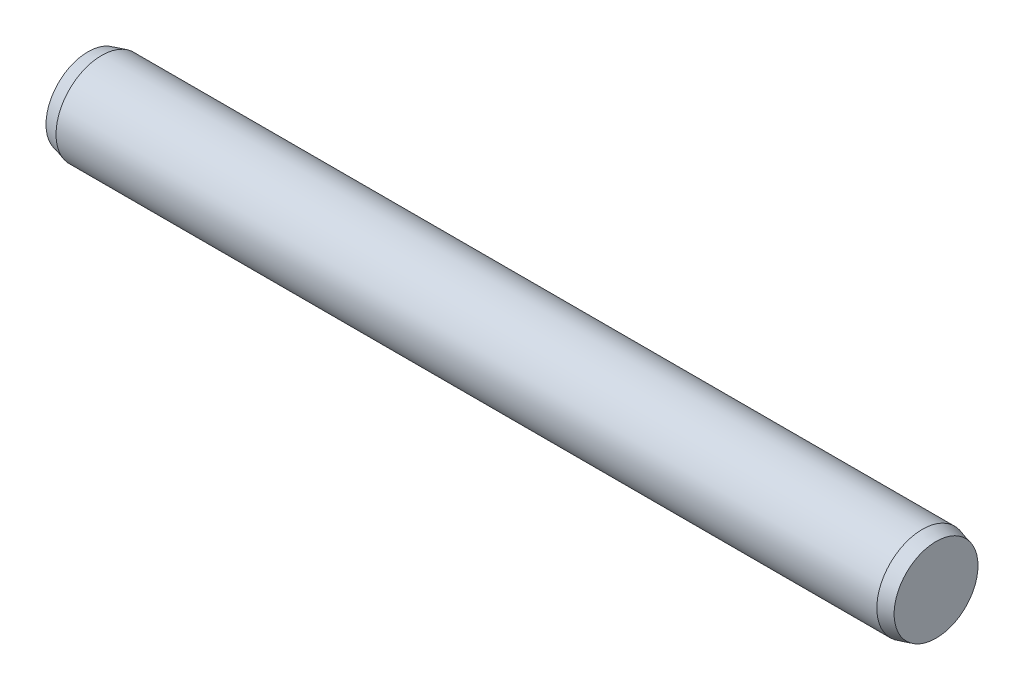
ISO-10303-21;
HEADER;
FILE_DESCRIPTION(('STEP AP214'),'2;1');
FILE_NAME('part.step','',(''),(''),'','','');
FILE_SCHEMA(('AUTOMOTIVE_DESIGN { 1 0 10303 214 1 1 1 1 }'));
ENDSEC;
DATA;
#1=APPLICATION_CONTEXT('core data for automotive mechanical design processes');
#2=APPLICATION_PROTOCOL_DEFINITION('international standard','automotive_design',2000,#1);
#3=PRODUCT_CONTEXT('',#1,'mechanical');
#4=PRODUCT('Part','Part','',(#3));
#5=PRODUCT_RELATED_PRODUCT_CATEGORY('part','',(#4));
#6=PRODUCT_DEFINITION_FORMATION('','',#4);
#7=PRODUCT_DEFINITION_CONTEXT('part definition',#1,'design');
#8=PRODUCT_DEFINITION('design','',#6,#7);
#9=PRODUCT_DEFINITION_SHAPE('','',#8);
#10=(LENGTH_UNIT() NAMED_UNIT(*) SI_UNIT(.MILLI.,.METRE.));
#11=(NAMED_UNIT(*) PLANE_ANGLE_UNIT() SI_UNIT($,.RADIAN.));
#12=(NAMED_UNIT(*) SI_UNIT($,.STERADIAN.) SOLID_ANGLE_UNIT());
#13=UNCERTAINTY_MEASURE_WITH_UNIT(LENGTH_MEASURE(1.E-05),#10,'distance_accuracy_value','');
#14=(GEOMETRIC_REPRESENTATION_CONTEXT(3) GLOBAL_UNCERTAINTY_ASSIGNED_CONTEXT((#13)) GLOBAL_UNIT_ASSIGNED_CONTEXT((#10,
#11,#12)) REPRESENTATION_CONTEXT('',''));
#15=CARTESIAN_POINT('',(0.,0.,0.));
#16=DIRECTION('',(0.,0.,1.));
#17=DIRECTION('',(1.,0.,0.));
#18=AXIS2_PLACEMENT_3D('',#15,#16,#17);
#19=CARTESIAN_POINT('',(-9.,0.,0.));
#20=DIRECTION('',(1.,0.,0.));
#21=DIRECTION('',(0.,0.,-1.));
#22=AXIS2_PLACEMENT_3D('',#19,#20,#21);
#23=CYLINDRICAL_SURFACE('',#22,1.);
#24=CARTESIAN_POINT('',(-9.,0.,0.));
#25=DIRECTION('',(-1.,0.,0.));
#26=DIRECTION('',(0.,0.,1.));
#27=AXIS2_PLACEMENT_3D('',#24,#25,#26);
#28=CIRCLE('',#27,1.);
#29=CARTESIAN_POINT('',(-9.,0.,1.));
#30=VERTEX_POINT('',#29);
#31=EDGE_CURVE('E43',#30,#30,#28,.T.);
#32=ORIENTED_EDGE('',*,*,#31,.F.);
#33=EDGE_LOOP('',(#32));
#34=FACE_BOUND('',#33,.T.);
#35=CARTESIAN_POINT('',(9.,0.,0.));
#36=DIRECTION('',(1.,0.,0.));
#37=DIRECTION('',(0.,0.,-1.));
#38=AXIS2_PLACEMENT_3D('',#35,#36,#37);
#39=CIRCLE('',#38,1.);
#40=CARTESIAN_POINT('',(9.,0.,-1.));
#41=VERTEX_POINT('',#40);
#42=EDGE_CURVE('E10',#41,#41,#39,.T.);
#43=ORIENTED_EDGE('',*,*,#42,.F.);
#44=EDGE_LOOP('',(#43));
#45=FACE_BOUND('',#44,.T.);
#46=ADVANCED_FACE('F29',(#34,#45),#23,.T.);
#47=CARTESIAN_POINT('',(9.,0.,0.));
#48=DIRECTION('',(-1.,0.,0.));
#49=DIRECTION('',(0.,0.,-1.));
#50=AXIS2_PLACEMENT_3D('',#47,#48,#49);
#51=CONICAL_SURFACE('',#50,1.,0.26179938779915);
#52=CARTESIAN_POINT('',(9.3,0.,0.));
#53=DIRECTION('',(1.,0.,0.));
#54=DIRECTION('',(0.,0.,-1.));
#55=AXIS2_PLACEMENT_3D('',#52,#53,#54);
#56=CIRCLE('',#55,0.919615242270665);
#57=CARTESIAN_POINT('',(9.3,0.,-0.919615242270665));
#58=VERTEX_POINT('',#57);
#59=EDGE_CURVE('E35',#58,#58,#56,.T.);
#60=ORIENTED_EDGE('',*,*,#59,.F.);
#61=EDGE_LOOP('',(#60));
#62=FACE_BOUND('',#61,.T.);
#63=ORIENTED_EDGE('',*,*,#42,.T.);
#64=EDGE_LOOP('',(#63));
#65=FACE_BOUND('',#64,.T.);
#66=ADVANCED_FACE('F53',(#62,#65),#51,.T.);
#67=CARTESIAN_POINT('',(9.3,0.,0.));
#68=DIRECTION('',(1.,0.,0.));
#69=DIRECTION('',(0.,0.,-1.));
#70=AXIS2_PLACEMENT_3D('',#67,#68,#69);
#71=PLANE('',#70);
#72=ORIENTED_EDGE('',*,*,#59,.T.);
#73=EDGE_LOOP('',(#72));
#74=FACE_BOUND('',#73,.T.);
#75=ADVANCED_FACE('F57',(#74),#71,.T.);
#76=CARTESIAN_POINT('',(-9.,0.,0.));
#77=DIRECTION('',(1.,0.,0.));
#78=DIRECTION('',(0.,0.,1.));
#79=AXIS2_PLACEMENT_3D('',#76,#77,#78);
#80=CONICAL_SURFACE('',#79,1.,0.26179938779915);
#81=CARTESIAN_POINT('',(-9.3,0.,0.));
#82=DIRECTION('',(-1.,0.,0.));
#83=DIRECTION('',(0.,0.,1.));
#84=AXIS2_PLACEMENT_3D('',#81,#82,#83);
#85=CIRCLE('',#84,0.919615242270665);
#86=CARTESIAN_POINT('',(-9.3,0.,0.919615242270665));
#87=VERTEX_POINT('',#86);
#88=EDGE_CURVE('E39',#87,#87,#85,.T.);
#89=ORIENTED_EDGE('',*,*,#88,.F.);
#90=EDGE_LOOP('',(#89));
#91=FACE_BOUND('',#90,.T.);
#92=ORIENTED_EDGE('',*,*,#31,.T.);
#93=EDGE_LOOP('',(#92));
#94=FACE_BOUND('',#93,.T.);
#95=ADVANCED_FACE('F49',(#91,#94),#80,.T.);
#96=CARTESIAN_POINT('',(-9.3,0.,0.));
#97=DIRECTION('',(-1.,0.,0.));
#98=DIRECTION('',(0.,0.,1.));
#99=AXIS2_PLACEMENT_3D('',#96,#97,#98);
#100=PLANE('',#99);
#101=ORIENTED_EDGE('',*,*,#88,.T.);
#102=EDGE_LOOP('',(#101));
#103=FACE_BOUND('',#102,.T.);
#104=ADVANCED_FACE('F66',(#103),#100,.T.);
#105=CLOSED_SHELL('',(#46,#66,#75,#95,#104));
#106=MANIFOLD_SOLID_BREP('B2',#105);
#107=ADVANCED_BREP_SHAPE_REPRESENTATION('',(#18,#106),#14);
#108=SHAPE_DEFINITION_REPRESENTATION(#9,#107);
ENDSEC;
END-ISO-10303-21;
